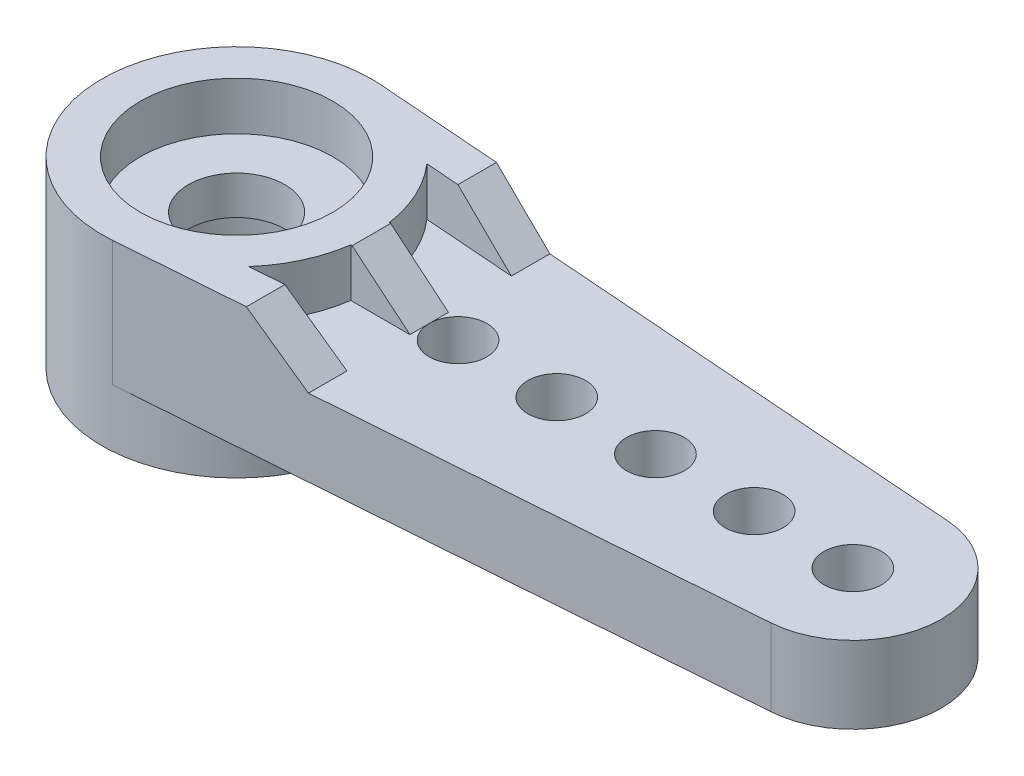
ISO-10303-21;
HEADER;
FILE_DESCRIPTION(('STEP AP214'),'2;1');
FILE_NAME('part.step','',(''),(''),'','','');
FILE_SCHEMA(('AUTOMOTIVE_DESIGN { 1 0 10303 214 1 1 1 1 }'));
ENDSEC;
DATA;
#1=APPLICATION_CONTEXT('core data for automotive mechanical design processes');
#2=APPLICATION_PROTOCOL_DEFINITION('international standard','automotive_design',2000,#1);
#3=PRODUCT_CONTEXT('',#1,'mechanical');
#4=PRODUCT('Part','Part','',(#3));
#5=PRODUCT_RELATED_PRODUCT_CATEGORY('part','',(#4));
#6=PRODUCT_DEFINITION_FORMATION('','',#4);
#7=PRODUCT_DEFINITION_CONTEXT('part definition',#1,'design');
#8=PRODUCT_DEFINITION('design','',#6,#7);
#9=PRODUCT_DEFINITION_SHAPE('','',#8);
#10=(LENGTH_UNIT() NAMED_UNIT(*) SI_UNIT(.MILLI.,.METRE.));
#11=(NAMED_UNIT(*) PLANE_ANGLE_UNIT() SI_UNIT($,.RADIAN.));
#12=(NAMED_UNIT(*) SI_UNIT($,.STERADIAN.) SOLID_ANGLE_UNIT());
#13=UNCERTAINTY_MEASURE_WITH_UNIT(LENGTH_MEASURE(1.E-05),#10,'distance_accuracy_value','');
#14=(GEOMETRIC_REPRESENTATION_CONTEXT(3) GLOBAL_UNCERTAINTY_ASSIGNED_CONTEXT((#13)) GLOBAL_UNIT_ASSIGNED_CONTEXT((#10,
#11,#12)) REPRESENTATION_CONTEXT('',''));
#15=CARTESIAN_POINT('',(0.,0.,0.));
#16=DIRECTION('',(0.,0.,1.));
#17=DIRECTION('',(1.,0.,0.));
#18=AXIS2_PLACEMENT_3D('',#15,#16,#17);
#19=CARTESIAN_POINT('',(0.,2.,0.));
#20=DIRECTION('',(0.,-1.,0.));
#21=DIRECTION('',(0.,0.,-1.));
#22=AXIS2_PLACEMENT_3D('',#19,#20,#21);
#23=CYLINDRICAL_SURFACE('',#22,3.5);
#24=DIRECTION('',(0.,-1.,0.));
#25=VECTOR('',#24,1.);
#26=CARTESIAN_POINT('',(2.62743232436456,8.17782908421862,-2.3122714764673));
#27=LINE('',#26,#25);
#28=CARTESIAN_POINT('',(2.62743232436456,3.25,-2.3122714764673));
#29=VERTEX_POINT('',#28);
#30=CARTESIAN_POINT('',(2.62743232436456,2.,-2.3122714764673));
#31=VERTEX_POINT('',#30);
#32=EDGE_CURVE('E166',#29,#31,#27,.T.);
#33=ORIENTED_EDGE('',*,*,#32,.F.);
#34=CARTESIAN_POINT('',(0.,3.25,0.));
#35=DIRECTION('',(0.,1.,0.));
#36=DIRECTION('',(0.,0.,1.));
#37=AXIS2_PLACEMENT_3D('',#34,#35,#36);
#38=CIRCLE('',#37,3.5);
#39=CARTESIAN_POINT('',(3.46410161513776,3.25,-0.5));
#40=VERTEX_POINT('',#39);
#41=EDGE_CURVE('E224',#40,#29,#38,.T.);
#42=ORIENTED_EDGE('',*,*,#41,.F.);
#43=DIRECTION('',(0.,-1.,0.));
#44=VECTOR('',#43,1.);
#45=CARTESIAN_POINT('',(3.46410161513776,2.,-0.5));
#46=LINE('',#45,#44);
#47=CARTESIAN_POINT('',(3.46410161513776,2.,-0.5));
#48=VERTEX_POINT('',#47);
#49=EDGE_CURVE('E246',#48,#40,#46,.F.);
#50=ORIENTED_EDGE('',*,*,#49,.F.);
#51=CARTESIAN_POINT('',(0.,2.,0.));
#52=DIRECTION('',(0.,1.,0.));
#53=DIRECTION('',(0.,0.,1.));
#54=AXIS2_PLACEMENT_3D('',#51,#52,#53);
#55=CIRCLE('',#54,3.5);
#56=EDGE_CURVE('E233',#48,#31,#55,.T.);
#57=ORIENTED_EDGE('',*,*,#56,.T.);
#58=EDGE_LOOP('',(#33,#42,#50,#57));
#59=FACE_BOUND('',#58,.T.);
#60=ADVANCED_FACE('F43',(#59),#23,.T.);
#61=CARTESIAN_POINT('',(0.,-1.5,0.));
#62=DIRECTION('',(0.,-1.,0.));
#63=DIRECTION('',(0.,0.,-1.));
#64=AXIS2_PLACEMENT_3D('',#61,#62,#63);
#65=CIRCLE('',#64,3.5);
#66=CARTESIAN_POINT('',(0.,-1.5,-3.5));
#67=VERTEX_POINT('',#66);
#68=EDGE_CURVE('E215',#67,#67,#65,.T.);
#69=ORIENTED_EDGE('',*,*,#68,.F.);
#70=EDGE_LOOP('',(#69));
#71=FACE_BOUND('',#70,.T.);
#72=CARTESIAN_POINT('',(0.2625,3.25,-3.49014236815635));
#73=VERTEX_POINT('',#72);
#74=CARTESIAN_POINT('',(0.2625,3.25,3.49014236815635));
#75=VERTEX_POINT('',#74);
#76=EDGE_CURVE('E234',#73,#75,#38,.T.);
#77=ORIENTED_EDGE('',*,*,#76,.F.);
#78=DIRECTION('',(0.,-1.,0.));
#79=VECTOR('',#78,1.);
#80=CARTESIAN_POINT('',(0.2625,2.,-3.49014236815635));
#81=LINE('',#80,#79);
#82=CARTESIAN_POINT('',(0.2625,0.,-3.49014236815635));
#83=VERTEX_POINT('',#82);
#84=EDGE_CURVE('E201',#73,#83,#81,.T.);
#85=ORIENTED_EDGE('',*,*,#84,.T.);
#86=CARTESIAN_POINT('',(0.,0.,0.));
#87=DIRECTION('',(0.,-1.,0.));
#88=DIRECTION('',(0.,0.,-1.));
#89=AXIS2_PLACEMENT_3D('',#86,#87,#88);
#90=CIRCLE('',#89,3.5);
#91=CARTESIAN_POINT('',(0.2625,0.,3.49014236815635));
#92=VERTEX_POINT('',#91);
#93=EDGE_CURVE('E220',#83,#92,#90,.T.);
#94=ORIENTED_EDGE('',*,*,#93,.T.);
#95=DIRECTION('',(0.,-1.,0.));
#96=VECTOR('',#95,1.);
#97=CARTESIAN_POINT('',(0.2625,2.,3.49014236815635));
#98=LINE('',#97,#96);
#99=EDGE_CURVE('E190',#75,#92,#98,.T.);
#100=ORIENTED_EDGE('',*,*,#99,.F.);
#101=EDGE_LOOP('',(#77,#85,#94,#100));
#102=FACE_BOUND('',#101,.T.);
#103=ADVANCED_FACE('F343',(#71,#102),#23,.T.);
#104=CARTESIAN_POINT('',(2.62743232436456,3.25,2.3122714764673));
#105=VERTEX_POINT('',#104);
#106=CARTESIAN_POINT('',(3.46410161513776,3.25,0.5));
#107=VERTEX_POINT('',#106);
#108=EDGE_CURVE('E229',#105,#107,#38,.T.);
#109=ORIENTED_EDGE('',*,*,#108,.F.);
#110=DIRECTION('',(0.,-1.,0.));
#111=VECTOR('',#110,1.);
#112=CARTESIAN_POINT('',(2.62743232436456,8.17782908421862,2.3122714764673));
#113=LINE('',#112,#111);
#114=CARTESIAN_POINT('',(2.62743232436456,2.,2.3122714764673));
#115=VERTEX_POINT('',#114);
#116=EDGE_CURVE('E268',#105,#115,#113,.T.);
#117=ORIENTED_EDGE('',*,*,#116,.T.);
#118=CARTESIAN_POINT('',(3.46410161513776,2.,0.5));
#119=VERTEX_POINT('',#118);
#120=EDGE_CURVE('E226',#115,#119,#55,.T.);
#121=ORIENTED_EDGE('',*,*,#120,.T.);
#122=DIRECTION('',(0.,-1.,0.));
#123=VECTOR('',#122,1.);
#124=CARTESIAN_POINT('',(3.46410161513776,2.,0.5));
#125=LINE('',#124,#123);
#126=EDGE_CURVE('E255',#107,#119,#125,.T.);
#127=ORIENTED_EDGE('',*,*,#126,.F.);
#128=EDGE_LOOP('',(#109,#117,#121,#127));
#129=FACE_BOUND('',#128,.T.);
#130=ADVANCED_FACE('F332',(#129),#23,.T.);
#131=CARTESIAN_POINT('',(0.,0.,0.));
#132=DIRECTION('',(0.,1.,0.));
#133=DIRECTION('',(0.,0.,1.));
#134=AXIS2_PLACEMENT_3D('',#131,#132,#133);
#135=PLANE('',#134);
#136=CARTESIAN_POINT('',(5.75,0.,0.));
#137=DIRECTION('',(0.,1.,0.));
#138=DIRECTION('',(0.,0.,1.));
#139=AXIS2_PLACEMENT_3D('',#136,#137,#138);
#140=CIRCLE('',#139,0.75);
#141=CARTESIAN_POINT('',(5.75,0.,0.75));
#142=VERTEX_POINT('',#141);
#143=EDGE_CURVE('E293',#142,#142,#140,.T.);
#144=ORIENTED_EDGE('',*,*,#143,.T.);
#145=EDGE_LOOP('',(#144));
#146=FACE_BOUND('',#145,.T.);
#147=CARTESIAN_POINT('',(8.3125,0.,0.));
#148=DIRECTION('',(0.,1.,0.));
#149=DIRECTION('',(0.,0.,1.));
#150=AXIS2_PLACEMENT_3D('',#147,#148,#149);
#151=CIRCLE('',#150,0.75);
#152=CARTESIAN_POINT('',(8.3125,0.,0.75));
#153=VERTEX_POINT('',#152);
#154=EDGE_CURVE('E271',#153,#153,#151,.T.);
#155=ORIENTED_EDGE('',*,*,#154,.T.);
#156=EDGE_LOOP('',(#155));
#157=FACE_BOUND('',#156,.T.);
#158=CARTESIAN_POINT('',(10.875,0.,0.));
#159=DIRECTION('',(0.,1.,0.));
#160=DIRECTION('',(0.,0.,1.));
#161=AXIS2_PLACEMENT_3D('',#158,#159,#160);
#162=CIRCLE('',#161,0.75);
#163=CARTESIAN_POINT('',(10.875,0.,0.75));
#164=VERTEX_POINT('',#163);
#165=EDGE_CURVE('E285',#164,#164,#162,.T.);
#166=ORIENTED_EDGE('',*,*,#165,.T.);
#167=EDGE_LOOP('',(#166));
#168=FACE_BOUND('',#167,.T.);
#169=CARTESIAN_POINT('',(13.4375,0.,0.));
#170=DIRECTION('',(0.,1.,0.));
#171=DIRECTION('',(0.,0.,1.));
#172=AXIS2_PLACEMENT_3D('',#169,#170,#171);
#173=CIRCLE('',#172,0.75);
#174=CARTESIAN_POINT('',(13.4375,0.,0.75));
#175=VERTEX_POINT('',#174);
#176=EDGE_CURVE('E284',#175,#175,#173,.T.);
#177=ORIENTED_EDGE('',*,*,#176,.T.);
#178=EDGE_LOOP('',(#177));
#179=FACE_BOUND('',#178,.T.);
#180=CARTESIAN_POINT('',(16.,0.,0.));
#181=DIRECTION('',(0.,1.,0.));
#182=DIRECTION('',(0.,0.,1.));
#183=AXIS2_PLACEMENT_3D('',#180,#181,#182);
#184=CIRCLE('',#183,0.750000000000002);
#185=CARTESIAN_POINT('',(16.,0.,0.750000000000002));
#186=VERTEX_POINT('',#185);
#187=EDGE_CURVE('E287',#186,#186,#184,.T.);
#188=ORIENTED_EDGE('',*,*,#187,.T.);
#189=EDGE_LOOP('',(#188));
#190=FACE_BOUND('',#189,.T.);
#191=ORIENTED_EDGE('',*,*,#93,.F.);
#192=DIRECTION('',(-0.997183533758957,0.,-0.075));
#193=VECTOR('',#192,1.);
#194=CARTESIAN_POINT('',(0.2625,0.,-3.49014236815635));
#195=LINE('',#194,#193);
#196=CARTESIAN_POINT('',(16.1725,0.,-2.2935221276456));
#197=VERTEX_POINT('',#196);
#198=EDGE_CURVE('E203',#197,#83,#195,.T.);
#199=ORIENTED_EDGE('',*,*,#198,.F.);
#200=CARTESIAN_POINT('',(16.,0.,0.));
#201=DIRECTION('',(0.,1.,0.));
#202=DIRECTION('',(0.,0.,1.));
#203=AXIS2_PLACEMENT_3D('',#200,#201,#202);
#204=CIRCLE('',#203,2.3);
#205=CARTESIAN_POINT('',(16.1725,0.,2.2935221276456));
#206=VERTEX_POINT('',#205);
#207=EDGE_CURVE('E206',#206,#197,#204,.T.);
#208=ORIENTED_EDGE('',*,*,#207,.F.);
#209=DIRECTION('',(0.997183533758957,0.,-0.075));
#210=VECTOR('',#209,1.);
#211=CARTESIAN_POINT('',(0.2625,0.,3.49014236815635));
#212=LINE('',#211,#210);
#213=EDGE_CURVE('E208',#92,#206,#212,.T.);
#214=ORIENTED_EDGE('',*,*,#213,.F.);
#215=EDGE_LOOP('',(#191,#199,#208,#214));
#216=FACE_BOUND('',#215,.T.);
#217=ADVANCED_FACE('F328',(#146,#157,#168,#179,#190,#216),#135,.F.);
#218=CARTESIAN_POINT('',(0.2625,2.,3.49014236815635));
#219=DIRECTION('',(-0.075,0.,-0.997183533758957));
#220=DIRECTION('',(-0.997183533758957,0.,0.075));
#221=AXIS2_PLACEMENT_3D('',#218,#219,#220);
#222=PLANE('',#221);
#223=DIRECTION('',(0.997183533758957,0.,-0.075));
#224=VECTOR('',#223,1.);
#225=CARTESIAN_POINT('',(0.2625,2.,3.49014236815635));
#226=LINE('',#225,#224);
#227=CARTESIAN_POINT('',(5.,2.,3.13382631602438));
#228=VERTEX_POINT('',#227);
#229=CARTESIAN_POINT('',(16.1725,2.,2.2935221276456));
#230=VERTEX_POINT('',#229);
#231=EDGE_CURVE('E210',#228,#230,#226,.T.);
#232=ORIENTED_EDGE('',*,*,#231,.F.);
#233=DIRECTION('',(-0.76694214693118,0.639118455775985,0.057683123590108));
#234=VECTOR('',#233,1.);
#235=CARTESIAN_POINT('',(3.64363029525031,3.1303080872914,3.23584136582444));
#236=LINE('',#235,#234);
#237=CARTESIAN_POINT('',(3.49999999999999,3.25,3.24664406340125));
#238=VERTEX_POINT('',#237);
#239=EDGE_CURVE('E176',#228,#238,#236,.T.);
#240=ORIENTED_EDGE('',*,*,#239,.T.);
#241=DIRECTION('',(0.997183533758957,0.,-0.0749999999999999));
#242=VECTOR('',#241,1.);
#243=CARTESIAN_POINT('',(0.2625,3.25,3.49014236815635));
#244=LINE('',#243,#242);
#245=EDGE_CURVE('E269',#75,#238,#244,.T.);
#246=ORIENTED_EDGE('',*,*,#245,.F.);
#247=ORIENTED_EDGE('',*,*,#99,.T.);
#248=ORIENTED_EDGE('',*,*,#213,.T.);
#249=DIRECTION('',(0.,-1.,0.));
#250=VECTOR('',#249,1.);
#251=CARTESIAN_POINT('',(16.1725,2.,2.2935221276456));
#252=LINE('',#251,#250);
#253=EDGE_CURVE('E193',#230,#206,#252,.T.);
#254=ORIENTED_EDGE('',*,*,#253,.F.);
#255=EDGE_LOOP('',(#232,#240,#246,#247,#248,#254));
#256=FACE_BOUND('',#255,.T.);
#257=ADVANCED_FACE('F335',(#256),#222,.F.);
#258=CARTESIAN_POINT('',(16.,2.,0.));
#259=DIRECTION('',(0.,-1.,0.));
#260=DIRECTION('',(0.,0.,-1.));
#261=AXIS2_PLACEMENT_3D('',#258,#259,#260);
#262=CYLINDRICAL_SURFACE('',#261,2.3);
#263=ORIENTED_EDGE('',*,*,#207,.T.);
#264=DIRECTION('',(0.,-1.,0.));
#265=VECTOR('',#264,1.);
#266=CARTESIAN_POINT('',(16.1725,2.,-2.2935221276456));
#267=LINE('',#266,#265);
#268=CARTESIAN_POINT('',(16.1725,2.,-2.2935221276456));
#269=VERTEX_POINT('',#268);
#270=EDGE_CURVE('E197',#269,#197,#267,.T.);
#271=ORIENTED_EDGE('',*,*,#270,.F.);
#272=CARTESIAN_POINT('',(16.,2.,0.));
#273=DIRECTION('',(0.,1.,0.));
#274=DIRECTION('',(0.,0.,1.));
#275=AXIS2_PLACEMENT_3D('',#272,#273,#274);
#276=CIRCLE('',#275,2.3);
#277=EDGE_CURVE('E211',#230,#269,#276,.T.);
#278=ORIENTED_EDGE('',*,*,#277,.F.);
#279=ORIENTED_EDGE('',*,*,#253,.T.);
#280=EDGE_LOOP('',(#263,#271,#278,#279));
#281=FACE_BOUND('',#280,.T.);
#282=ADVANCED_FACE('F389',(#281),#262,.T.);
#283=CARTESIAN_POINT('',(0.2625,2.,-3.49014236815635));
#284=DIRECTION('',(-0.075,0.,0.997183533758957));
#285=DIRECTION('',(0.997183533758957,0.,0.075));
#286=AXIS2_PLACEMENT_3D('',#283,#284,#285);
#287=PLANE('',#286);
#288=DIRECTION('',(-0.997183533758957,0.,-0.0749999999999999));
#289=VECTOR('',#288,1.);
#290=CARTESIAN_POINT('',(0.2625,3.25,-3.49014236815635));
#291=LINE('',#290,#289);
#292=CARTESIAN_POINT('',(3.49999999999999,3.25,-3.24664406340125));
#293=VERTEX_POINT('',#292);
#294=EDGE_CURVE('E159',#293,#73,#291,.T.);
#295=ORIENTED_EDGE('',*,*,#294,.F.);
#296=DIRECTION('',(0.76694214693118,-0.639118455775985,0.057683123590108));
#297=VECTOR('',#296,1.);
#298=CARTESIAN_POINT('',(3.64363029525031,3.1303080872914,-3.23584136582444));
#299=LINE('',#298,#297);
#300=CARTESIAN_POINT('',(5.,2.,-3.13382631602438));
#301=VERTEX_POINT('',#300);
#302=EDGE_CURVE('E172',#293,#301,#299,.T.);
#303=ORIENTED_EDGE('',*,*,#302,.T.);
#304=DIRECTION('',(-0.997183533758957,0.,-0.075));
#305=VECTOR('',#304,1.);
#306=CARTESIAN_POINT('',(0.2625,2.,-3.49014236815635));
#307=LINE('',#306,#305);
#308=EDGE_CURVE('E160',#269,#301,#307,.T.);
#309=ORIENTED_EDGE('',*,*,#308,.F.);
#310=ORIENTED_EDGE('',*,*,#270,.T.);
#311=ORIENTED_EDGE('',*,*,#198,.T.);
#312=ORIENTED_EDGE('',*,*,#84,.F.);
#313=EDGE_LOOP('',(#295,#303,#309,#310,#311,#312));
#314=FACE_BOUND('',#313,.T.);
#315=ADVANCED_FACE('F313',(#314),#287,.F.);
#316=CARTESIAN_POINT('',(0.,2.,0.));
#317=DIRECTION('',(0.,1.,0.));
#318=DIRECTION('',(0.,0.,1.));
#319=AXIS2_PLACEMENT_3D('',#316,#317,#318);
#320=PLANE('',#319);
#321=CARTESIAN_POINT('',(8.3125,2.,0.));
#322=DIRECTION('',(0.,1.,0.));
#323=DIRECTION('',(0.,0.,1.));
#324=AXIS2_PLACEMENT_3D('',#321,#322,#323);
#325=CIRCLE('',#324,0.75);
#326=CARTESIAN_POINT('',(8.3125,2.,0.75));
#327=VERTEX_POINT('',#326);
#328=EDGE_CURVE('E303',#327,#327,#325,.T.);
#329=ORIENTED_EDGE('',*,*,#328,.F.);
#330=EDGE_LOOP('',(#329));
#331=FACE_BOUND('',#330,.T.);
#332=CARTESIAN_POINT('',(10.875,2.,0.));
#333=DIRECTION('',(0.,1.,0.));
#334=DIRECTION('',(0.,0.,1.));
#335=AXIS2_PLACEMENT_3D('',#332,#333,#334);
#336=CIRCLE('',#335,0.75);
#337=CARTESIAN_POINT('',(10.875,2.,0.75));
#338=VERTEX_POINT('',#337);
#339=EDGE_CURVE('E297',#338,#338,#336,.T.);
#340=ORIENTED_EDGE('',*,*,#339,.F.);
#341=EDGE_LOOP('',(#340));
#342=FACE_BOUND('',#341,.T.);
#343=CARTESIAN_POINT('',(13.4375,2.,0.));
#344=DIRECTION('',(0.,1.,0.));
#345=DIRECTION('',(0.,0.,1.));
#346=AXIS2_PLACEMENT_3D('',#343,#344,#345);
#347=CIRCLE('',#346,0.75);
#348=CARTESIAN_POINT('',(13.4375,2.,0.75));
#349=VERTEX_POINT('',#348);
#350=EDGE_CURVE('E300',#349,#349,#347,.T.);
#351=ORIENTED_EDGE('',*,*,#350,.F.);
#352=EDGE_LOOP('',(#351));
#353=FACE_BOUND('',#352,.T.);
#354=CARTESIAN_POINT('',(16.,2.,0.));
#355=DIRECTION('',(0.,1.,0.));
#356=DIRECTION('',(0.,0.,1.));
#357=AXIS2_PLACEMENT_3D('',#354,#355,#356);
#358=CIRCLE('',#357,0.750000000000002);
#359=CARTESIAN_POINT('',(16.,2.,0.750000000000002));
#360=VERTEX_POINT('',#359);
#361=EDGE_CURVE('E295',#360,#360,#358,.T.);
#362=ORIENTED_EDGE('',*,*,#361,.F.);
#363=EDGE_LOOP('',(#362));
#364=FACE_BOUND('',#363,.T.);
#365=DIRECTION('',(0.,0.,-1.));
#366=VECTOR('',#365,1.);
#367=CARTESIAN_POINT('',(5.,2.,0.5));
#368=LINE('',#367,#366);
#369=CARTESIAN_POINT('',(5.,1.99999999999999,0.));
#370=VERTEX_POINT('',#369);
#371=CARTESIAN_POINT('',(5.,2.,-0.5));
#372=VERTEX_POINT('',#371);
#373=EDGE_CURVE('E261',#370,#372,#368,.T.);
#374=ORIENTED_EDGE('',*,*,#373,.F.);
#375=CARTESIAN_POINT('',(5.75,2.,0.));
#376=DIRECTION('',(0.,1.,0.));
#377=DIRECTION('',(0.,0.,1.));
#378=AXIS2_PLACEMENT_3D('',#375,#376,#377);
#379=CIRCLE('',#378,0.75);
#380=EDGE_CURVE('E60',#370,#370,#379,.T.);
#381=ORIENTED_EDGE('',*,*,#380,.F.);
#382=CARTESIAN_POINT('',(5.,2.,0.5));
#383=VERTEX_POINT('',#382);
#384=EDGE_CURVE('E250',#383,#370,#368,.T.);
#385=ORIENTED_EDGE('',*,*,#384,.F.);
#386=DIRECTION('',(1.,0.,0.));
#387=VECTOR('',#386,1.);
#388=CARTESIAN_POINT('',(-3.501,2.,0.5));
#389=LINE('',#388,#387);
#390=EDGE_CURVE('E245',#119,#383,#389,.T.);
#391=ORIENTED_EDGE('',*,*,#390,.F.);
#392=ORIENTED_EDGE('',*,*,#120,.F.);
#393=DIRECTION('',(-0.997183533758956,0.,0.0750000000000002));
#394=VECTOR('',#393,1.);
#395=CARTESIAN_POINT('',(2.62743232436456,2.,2.3122714764673));
#396=LINE('',#395,#394);
#397=CARTESIAN_POINT('',(5.,2.,2.13382631602438));
#398=VERTEX_POINT('',#397);
#399=EDGE_CURVE('E265',#398,#115,#396,.T.);
#400=ORIENTED_EDGE('',*,*,#399,.F.);
#401=DIRECTION('',(0.,0.,-1.));
#402=VECTOR('',#401,1.);
#403=CARTESIAN_POINT('',(5.,2.,3.13382631602438));
#404=LINE('',#403,#402);
#405=EDGE_CURVE('E264',#228,#398,#404,.T.);
#406=ORIENTED_EDGE('',*,*,#405,.F.);
#407=ORIENTED_EDGE('',*,*,#231,.T.);
#408=ORIENTED_EDGE('',*,*,#277,.T.);
#409=ORIENTED_EDGE('',*,*,#308,.T.);
#410=DIRECTION('',(0.,0.,-1.));
#411=VECTOR('',#410,1.);
#412=CARTESIAN_POINT('',(5.,2.,-3.13382631602438));
#413=LINE('',#412,#411);
#414=CARTESIAN_POINT('',(5.,2.,-2.13382631602438));
#415=VERTEX_POINT('',#414);
#416=EDGE_CURVE('E146',#415,#301,#413,.T.);
#417=ORIENTED_EDGE('',*,*,#416,.F.);
#418=DIRECTION('',(0.997183533758956,0.,0.0750000000000002));
#419=VECTOR('',#418,1.);
#420=CARTESIAN_POINT('',(2.62743232436456,2.,-2.3122714764673));
#421=LINE('',#420,#419);
#422=EDGE_CURVE('E153',#31,#415,#421,.T.);
#423=ORIENTED_EDGE('',*,*,#422,.F.);
#424=ORIENTED_EDGE('',*,*,#56,.F.);
#425=DIRECTION('',(1.,0.,0.));
#426=VECTOR('',#425,1.);
#427=CARTESIAN_POINT('',(-3.501,2.,-0.5));
#428=LINE('',#427,#426);
#429=EDGE_CURVE('E243',#48,#372,#428,.T.);
#430=ORIENTED_EDGE('',*,*,#429,.T.);
#431=EDGE_LOOP('',(#374,#381,#385,#391,#392,#400,#406,#407,#408,#409,#417,#423,#424,#430));
#432=FACE_BOUND('',#431,.T.);
#433=ADVANCED_FACE('F155',(#331,#342,#353,#364,#432),#320,.T.);
#434=CARTESIAN_POINT('',(0.,-1.5,0.));
#435=DIRECTION('',(0.,-1.,0.));
#436=DIRECTION('',(0.,0.,-1.));
#437=AXIS2_PLACEMENT_3D('',#434,#435,#436);
#438=PLANE('',#437);
#439=CARTESIAN_POINT('',(0.,-1.5,0.));
#440=DIRECTION('',(0.,-1.,0.));
#441=DIRECTION('',(0.,0.,-1.));
#442=AXIS2_PLACEMENT_3D('',#439,#440,#441);
#443=CIRCLE('',#442,2.6);
#444=CARTESIAN_POINT('',(0.,-1.5,-2.6));
#445=VERTEX_POINT('',#444);
#446=EDGE_CURVE('E225',#445,#445,#443,.T.);
#447=ORIENTED_EDGE('',*,*,#446,.F.);
#448=EDGE_LOOP('',(#447));
#449=FACE_BOUND('',#448,.T.);
#450=ORIENTED_EDGE('',*,*,#68,.T.);
#451=EDGE_LOOP('',(#450));
#452=FACE_BOUND('',#451,.T.);
#453=ADVANCED_FACE('F312',(#449,#452),#438,.T.);
#454=CARTESIAN_POINT('',(0.,1.,0.));
#455=DIRECTION('',(0.,-1.,0.));
#456=DIRECTION('',(0.,0.,-1.));
#457=AXIS2_PLACEMENT_3D('',#454,#455,#456);
#458=CYLINDRICAL_SURFACE('',#457,2.6);
#459=CARTESIAN_POINT('',(0.,1.,0.));
#460=DIRECTION('',(0.,-1.,0.));
#461=DIRECTION('',(0.,0.,-1.));
#462=AXIS2_PLACEMENT_3D('',#459,#460,#461);
#463=CIRCLE('',#462,2.6);
#464=CARTESIAN_POINT('',(0.,1.,-2.6));
#465=VERTEX_POINT('',#464);
#466=EDGE_CURVE('E218',#465,#465,#463,.T.);
#467=ORIENTED_EDGE('',*,*,#466,.F.);
#468=EDGE_LOOP('',(#467));
#469=FACE_BOUND('',#468,.T.);
#470=ORIENTED_EDGE('',*,*,#446,.T.);
#471=EDGE_LOOP('',(#470));
#472=FACE_BOUND('',#471,.T.);
#473=ADVANCED_FACE('F552',(#469,#472),#458,.F.);
#474=CARTESIAN_POINT('',(0.,1.,0.));
#475=DIRECTION('',(0.,-1.,0.));
#476=DIRECTION('',(0.,0.,-1.));
#477=AXIS2_PLACEMENT_3D('',#474,#475,#476);
#478=PLANE('',#477);
#479=CARTESIAN_POINT('',(0.,1.,0.));
#480=DIRECTION('',(0.,-1.,0.));
#481=DIRECTION('',(0.,0.,-1.));
#482=AXIS2_PLACEMENT_3D('',#479,#480,#481);
#483=CIRCLE('',#482,1.25);
#484=CARTESIAN_POINT('',(0.,1.,-1.25));
#485=VERTEX_POINT('',#484);
#486=EDGE_CURVE('E189',#485,#485,#483,.T.);
#487=ORIENTED_EDGE('',*,*,#486,.F.);
#488=EDGE_LOOP('',(#487));
#489=FACE_BOUND('',#488,.T.);
#490=ORIENTED_EDGE('',*,*,#466,.T.);
#491=EDGE_LOOP('',(#490));
#492=FACE_BOUND('',#491,.T.);
#493=ADVANCED_FACE('F407',(#489,#492),#478,.T.);
#494=CARTESIAN_POINT('',(0.,3.25,0.));
#495=DIRECTION('',(0.,1.,0.));
#496=DIRECTION('',(0.,0.,1.));
#497=AXIS2_PLACEMENT_3D('',#494,#495,#496);
#498=PLANE('',#497);
#499=CARTESIAN_POINT('',(0.,3.25,0.));
#500=DIRECTION('',(0.,1.,0.));
#501=DIRECTION('',(0.,0.,1.));
#502=AXIS2_PLACEMENT_3D('',#499,#500,#501);
#503=CIRCLE('',#502,2.5);
#504=CARTESIAN_POINT('',(0.,3.25,2.5));
#505=VERTEX_POINT('',#504);
#506=EDGE_CURVE('E192',#505,#505,#503,.T.);
#507=ORIENTED_EDGE('',*,*,#506,.F.);
#508=EDGE_LOOP('',(#507));
#509=FACE_BOUND('',#508,.T.);
#510=ORIENTED_EDGE('',*,*,#245,.T.);
#511=DIRECTION('',(0.,0.,-1.));
#512=VECTOR('',#511,1.);
#513=CARTESIAN_POINT('',(3.49999999999999,3.25,2.13382631602438));
#514=LINE('',#513,#512);
#515=CARTESIAN_POINT('',(3.49999999999999,3.25,2.24664406340126));
#516=VERTEX_POINT('',#515);
#517=EDGE_CURVE('E185',#238,#516,#514,.T.);
#518=ORIENTED_EDGE('',*,*,#517,.T.);
#519=DIRECTION('',(-0.997183533758957,0.,0.0750000000000002));
#520=VECTOR('',#519,1.);
#521=CARTESIAN_POINT('',(2.62743232436456,3.25,2.3122714764673));
#522=LINE('',#521,#520);
#523=EDGE_CURVE('E266',#516,#105,#522,.T.);
#524=ORIENTED_EDGE('',*,*,#523,.T.);
#525=ORIENTED_EDGE('',*,*,#108,.T.);
#526=DIRECTION('',(1.,0.,0.));
#527=VECTOR('',#526,1.);
#528=CARTESIAN_POINT('',(-3.501,3.25,0.5));
#529=LINE('',#528,#527);
#530=CARTESIAN_POINT('',(3.49999999999999,3.25,0.5));
#531=VERTEX_POINT('',#530);
#532=EDGE_CURVE('E249',#107,#531,#529,.T.);
#533=ORIENTED_EDGE('',*,*,#532,.T.);
#534=DIRECTION('',(0.,0.,-1.));
#535=VECTOR('',#534,1.);
#536=CARTESIAN_POINT('',(3.49999999999999,3.25,0.));
#537=LINE('',#536,#535);
#538=CARTESIAN_POINT('',(3.49999999999999,3.25,-0.5));
#539=VERTEX_POINT('',#538);
#540=EDGE_CURVE('E61',#531,#539,#537,.T.);
#541=ORIENTED_EDGE('',*,*,#540,.T.);
#542=DIRECTION('',(1.,0.,0.));
#543=VECTOR('',#542,1.);
#544=CARTESIAN_POINT('',(-3.501,3.25,-0.5));
#545=LINE('',#544,#543);
#546=EDGE_CURVE('E247',#40,#539,#545,.T.);
#547=ORIENTED_EDGE('',*,*,#546,.F.);
#548=ORIENTED_EDGE('',*,*,#41,.T.);
#549=DIRECTION('',(0.997183533758957,0.,0.0750000000000002));
#550=VECTOR('',#549,1.);
#551=CARTESIAN_POINT('',(2.62743232436456,3.25,-2.3122714764673));
#552=LINE('',#551,#550);
#553=CARTESIAN_POINT('',(3.49999999999999,3.25,-2.24664406340126));
#554=VERTEX_POINT('',#553);
#555=EDGE_CURVE('E279',#29,#554,#552,.T.);
#556=ORIENTED_EDGE('',*,*,#555,.T.);
#557=DIRECTION('',(0.,0.,-1.));
#558=VECTOR('',#557,1.);
#559=CARTESIAN_POINT('',(3.49999999999999,3.25,-3.13382631602438));
#560=LINE('',#559,#558);
#561=EDGE_CURVE('E173',#554,#293,#560,.T.);
#562=ORIENTED_EDGE('',*,*,#561,.T.);
#563=ORIENTED_EDGE('',*,*,#294,.T.);
#564=ORIENTED_EDGE('',*,*,#76,.T.);
#565=EDGE_LOOP('',(#510,#518,#524,#525,#533,#541,#547,#548,#556,#562,#563,#564));
#566=FACE_BOUND('',#565,.T.);
#567=ADVANCED_FACE('F349',(#509,#566),#498,.T.);
#568=CARTESIAN_POINT('',(0.,2.,0.));
#569=DIRECTION('',(0.,1.,0.));
#570=DIRECTION('',(0.,0.,1.));
#571=AXIS2_PLACEMENT_3D('',#568,#569,#570);
#572=CYLINDRICAL_SURFACE('',#571,2.5);
#573=CARTESIAN_POINT('',(0.,2.,0.));
#574=DIRECTION('',(0.,1.,0.));
#575=DIRECTION('',(0.,0.,1.));
#576=AXIS2_PLACEMENT_3D('',#573,#574,#575);
#577=CIRCLE('',#576,2.5);
#578=CARTESIAN_POINT('',(0.,2.,2.5));
#579=VERTEX_POINT('',#578);
#580=EDGE_CURVE('E240',#579,#579,#577,.T.);
#581=ORIENTED_EDGE('',*,*,#580,.F.);
#582=EDGE_LOOP('',(#581));
#583=FACE_BOUND('',#582,.T.);
#584=ORIENTED_EDGE('',*,*,#506,.T.);
#585=EDGE_LOOP('',(#584));
#586=FACE_BOUND('',#585,.T.);
#587=ADVANCED_FACE('F403',(#583,#586),#572,.F.);
#588=CARTESIAN_POINT('',(0.,2.,0.));
#589=DIRECTION('',(0.,1.,0.));
#590=DIRECTION('',(0.,0.,1.));
#591=AXIS2_PLACEMENT_3D('',#588,#589,#590);
#592=PLANE('',#591);
#593=CARTESIAN_POINT('',(0.,2.,0.));
#594=DIRECTION('',(0.,1.,0.));
#595=DIRECTION('',(0.,0.,1.));
#596=AXIS2_PLACEMENT_3D('',#593,#594,#595);
#597=CIRCLE('',#596,1.25);
#598=CARTESIAN_POINT('',(0.,2.,1.25));
#599=VERTEX_POINT('',#598);
#600=EDGE_CURVE('E195',#599,#599,#597,.T.);
#601=ORIENTED_EDGE('',*,*,#600,.F.);
#602=EDGE_LOOP('',(#601));
#603=FACE_BOUND('',#602,.T.);
#604=ORIENTED_EDGE('',*,*,#580,.T.);
#605=EDGE_LOOP('',(#604));
#606=FACE_BOUND('',#605,.T.);
#607=ADVANCED_FACE('F545',(#603,#606),#592,.T.);
#608=CARTESIAN_POINT('',(0.,-1.5,0.));
#609=DIRECTION('',(0.,1.,0.));
#610=DIRECTION('',(0.,0.,1.));
#611=AXIS2_PLACEMENT_3D('',#608,#609,#610);
#612=CYLINDRICAL_SURFACE('',#611,1.25);
#613=ORIENTED_EDGE('',*,*,#486,.T.);
#614=EDGE_LOOP('',(#613));
#615=FACE_BOUND('',#614,.T.);
#616=ORIENTED_EDGE('',*,*,#600,.T.);
#617=EDGE_LOOP('',(#616));
#618=FACE_BOUND('',#617,.T.);
#619=ADVANCED_FACE('F414',(#615,#618),#612,.F.);
#620=CARTESIAN_POINT('',(-3.501,3.25,-0.5));
#621=DIRECTION('',(0.,0.,-1.));
#622=DIRECTION('',(0.,1.,0.));
#623=AXIS2_PLACEMENT_3D('',#620,#621,#622);
#624=PLANE('',#623);
#625=ORIENTED_EDGE('',*,*,#546,.T.);
#626=DIRECTION('',(-0.768221279597376,0.64018439966448,0.));
#627=VECTOR('',#626,1.);
#628=CARTESIAN_POINT('',(-0.631737704918039,6.69311475409836,-0.5));
#629=LINE('',#628,#627);
#630=EDGE_CURVE('E11',#539,#372,#629,.F.);
#631=ORIENTED_EDGE('',*,*,#630,.T.);
#632=ORIENTED_EDGE('',*,*,#429,.F.);
#633=ORIENTED_EDGE('',*,*,#49,.T.);
#634=EDGE_LOOP('',(#625,#631,#632,#633));
#635=FACE_BOUND('',#634,.T.);
#636=ADVANCED_FACE('F364',(#635),#624,.T.);
#637=CARTESIAN_POINT('',(-3.501,3.25,0.5));
#638=DIRECTION('',(0.,0.,1.));
#639=DIRECTION('',(0.,-1.,0.));
#640=AXIS2_PLACEMENT_3D('',#637,#638,#639);
#641=PLANE('',#640);
#642=ORIENTED_EDGE('',*,*,#390,.T.);
#643=DIRECTION('',(0.768221279597376,-0.64018439966448,0.));
#644=VECTOR('',#643,1.);
#645=CARTESIAN_POINT('',(-0.631737704918039,6.69311475409836,0.5));
#646=LINE('',#645,#644);
#647=EDGE_CURVE('E55',#383,#531,#646,.F.);
#648=ORIENTED_EDGE('',*,*,#647,.T.);
#649=ORIENTED_EDGE('',*,*,#532,.F.);
#650=ORIENTED_EDGE('',*,*,#126,.T.);
#651=EDGE_LOOP('',(#642,#648,#649,#650));
#652=FACE_BOUND('',#651,.T.);
#653=ADVANCED_FACE('F356',(#652),#641,.T.);
#654=CARTESIAN_POINT('',(2.62743232436456,8.17782908421862,2.3122714764673));
#655=DIRECTION('',(0.0750000000000002,0.,0.997183533758956));
#656=DIRECTION('',(0.997183533758957,0.,-0.0750000000000002));
#657=AXIS2_PLACEMENT_3D('',#654,#655,#656);
#658=PLANE('',#657);
#659=ORIENTED_EDGE('',*,*,#523,.F.);
#660=DIRECTION('',(0.766942146931181,-0.639118455775985,-0.0576831235901082));
#661=VECTOR('',#660,1.);
#662=CARTESIAN_POINT('',(3.59939067660242,3.16717443616464,2.23916870857156));
#663=LINE('',#662,#661);
#664=EDGE_CURVE('E179',#516,#398,#663,.T.);
#665=ORIENTED_EDGE('',*,*,#664,.T.);
#666=ORIENTED_EDGE('',*,*,#399,.T.);
#667=ORIENTED_EDGE('',*,*,#116,.F.);
#668=EDGE_LOOP('',(#659,#665,#666,#667));
#669=FACE_BOUND('',#668,.T.);
#670=ADVANCED_FACE('F421',(#669),#658,.F.);
#671=CARTESIAN_POINT('',(2.62743232436456,8.17782908421862,-2.3122714764673));
#672=DIRECTION('',(0.0750000000000002,0.,-0.997183533758956));
#673=DIRECTION('',(-0.997183533758957,0.,-0.0750000000000002));
#674=AXIS2_PLACEMENT_3D('',#671,#672,#673);
#675=PLANE('',#674);
#676=ORIENTED_EDGE('',*,*,#422,.T.);
#677=DIRECTION('',(-0.766942146931181,0.639118455775985,-0.0576831235901082));
#678=VECTOR('',#677,1.);
#679=CARTESIAN_POINT('',(3.59939067660242,3.16717443616464,-2.23916870857156));
#680=LINE('',#679,#678);
#681=EDGE_CURVE('E168',#415,#554,#680,.T.);
#682=ORIENTED_EDGE('',*,*,#681,.T.);
#683=ORIENTED_EDGE('',*,*,#555,.F.);
#684=ORIENTED_EDGE('',*,*,#32,.T.);
#685=EDGE_LOOP('',(#676,#682,#683,#684));
#686=FACE_BOUND('',#685,.T.);
#687=ADVANCED_FACE('F165',(#686),#675,.F.);
#688=CARTESIAN_POINT('',(3.49999999999999,3.25,0.));
#689=DIRECTION('',(0.640184399664481,0.768221279597375,0.));
#690=DIRECTION('',(0.,0.,1.));
#691=AXIS2_PLACEMENT_3D('',#688,#689,#690);
#692=PLANE('',#691);
#693=ORIENTED_EDGE('',*,*,#239,.F.);
#694=ORIENTED_EDGE('',*,*,#405,.T.);
#695=ORIENTED_EDGE('',*,*,#664,.F.);
#696=ORIENTED_EDGE('',*,*,#517,.F.);
#697=EDGE_LOOP('',(#693,#694,#695,#696));
#698=FACE_BOUND('',#697,.T.);
#699=ADVANCED_FACE('F437',(#698),#692,.T.);
#700=CARTESIAN_POINT('',(3.49999999999999,3.25,0.));
#701=DIRECTION('',(0.640184399664481,0.768221279597375,0.));
#702=DIRECTION('',(0.,0.,1.));
#703=AXIS2_PLACEMENT_3D('',#700,#701,#702);
#704=PLANE('',#703);
#705=ORIENTED_EDGE('',*,*,#681,.F.);
#706=ORIENTED_EDGE('',*,*,#416,.T.);
#707=ORIENTED_EDGE('',*,*,#302,.F.);
#708=ORIENTED_EDGE('',*,*,#561,.F.);
#709=EDGE_LOOP('',(#705,#706,#707,#708));
#710=FACE_BOUND('',#709,.T.);
#711=ADVANCED_FACE('F171',(#710),#704,.T.);
#712=CARTESIAN_POINT('',(5.,1.99999999999999,0.));
#713=DIRECTION('',(-0.64018439966448,-0.768221279597376,0.));
#714=DIRECTION('',(0.,0.,1.));
#715=AXIS2_PLACEMENT_3D('',#712,#713,#714);
#716=PLANE('',#715);
#717=ORIENTED_EDGE('',*,*,#630,.F.);
#718=ORIENTED_EDGE('',*,*,#540,.F.);
#719=ORIENTED_EDGE('',*,*,#647,.F.);
#720=ORIENTED_EDGE('',*,*,#384,.T.);
#721=ORIENTED_EDGE('',*,*,#373,.T.);
#722=EDGE_LOOP('',(#717,#718,#719,#720,#721));
#723=FACE_BOUND('',#722,.T.);
#724=ADVANCED_FACE('F46',(#723),#716,.F.);
#725=CARTESIAN_POINT('',(16.,-1.5,0.));
#726=DIRECTION('',(0.,1.,0.));
#727=DIRECTION('',(0.,0.,1.));
#728=AXIS2_PLACEMENT_3D('',#725,#726,#727);
#729=CYLINDRICAL_SURFACE('',#728,0.750000000000002);
#730=ORIENTED_EDGE('',*,*,#361,.T.);
#731=EDGE_LOOP('',(#730));
#732=FACE_BOUND('',#731,.T.);
#733=ORIENTED_EDGE('',*,*,#187,.F.);
#734=EDGE_LOOP('',(#733));
#735=FACE_BOUND('',#734,.T.);
#736=ADVANCED_FACE('F325',(#732,#735),#729,.F.);
#737=CARTESIAN_POINT('',(13.4375,-1.5,0.));
#738=DIRECTION('',(0.,1.,0.));
#739=DIRECTION('',(0.,0.,1.));
#740=AXIS2_PLACEMENT_3D('',#737,#738,#739);
#741=CYLINDRICAL_SURFACE('',#740,0.75);
#742=ORIENTED_EDGE('',*,*,#350,.T.);
#743=EDGE_LOOP('',(#742));
#744=FACE_BOUND('',#743,.T.);
#745=ORIENTED_EDGE('',*,*,#176,.F.);
#746=EDGE_LOOP('',(#745));
#747=FACE_BOUND('',#746,.T.);
#748=ADVANCED_FACE('F323',(#744,#747),#741,.F.);
#749=CARTESIAN_POINT('',(10.875,-1.5,0.));
#750=DIRECTION('',(0.,1.,0.));
#751=DIRECTION('',(0.,0.,1.));
#752=AXIS2_PLACEMENT_3D('',#749,#750,#751);
#753=CYLINDRICAL_SURFACE('',#752,0.75);
#754=ORIENTED_EDGE('',*,*,#339,.T.);
#755=EDGE_LOOP('',(#754));
#756=FACE_BOUND('',#755,.T.);
#757=ORIENTED_EDGE('',*,*,#165,.F.);
#758=EDGE_LOOP('',(#757));
#759=FACE_BOUND('',#758,.T.);
#760=ADVANCED_FACE('F481',(#756,#759),#753,.F.);
#761=CARTESIAN_POINT('',(8.3125,-1.5,0.));
#762=DIRECTION('',(0.,1.,0.));
#763=DIRECTION('',(0.,0.,1.));
#764=AXIS2_PLACEMENT_3D('',#761,#762,#763);
#765=CYLINDRICAL_SURFACE('',#764,0.75);
#766=ORIENTED_EDGE('',*,*,#328,.T.);
#767=EDGE_LOOP('',(#766));
#768=FACE_BOUND('',#767,.T.);
#769=ORIENTED_EDGE('',*,*,#154,.F.);
#770=EDGE_LOOP('',(#769));
#771=FACE_BOUND('',#770,.T.);
#772=ADVANCED_FACE('F308',(#768,#771),#765,.F.);
#773=CARTESIAN_POINT('',(5.75,-1.5,0.));
#774=DIRECTION('',(0.,1.,0.));
#775=DIRECTION('',(0.,0.,1.));
#776=AXIS2_PLACEMENT_3D('',#773,#774,#775);
#777=CYLINDRICAL_SURFACE('',#776,0.75);
#778=ORIENTED_EDGE('',*,*,#380,.T.);
#779=EDGE_LOOP('',(#778));
#780=FACE_BOUND('',#779,.T.);
#781=ORIENTED_EDGE('',*,*,#143,.F.);
#782=EDGE_LOOP('',(#781));
#783=FACE_BOUND('',#782,.T.);
#784=ADVANCED_FACE('F498',(#780,#783),#777,.F.);
#785=CLOSED_SHELL('',(#60,#103,#130,#217,#257,#282,#315,#433,#453,#473,#493,#567,#587,#607,#619,
#636,#653,#670,#687,#699,#711,#724,#736,#748,#760,#772,#784));
#786=MANIFOLD_SOLID_BREP('B2',#785);
#787=ADVANCED_BREP_SHAPE_REPRESENTATION('',(#18,#786),#14);
#788=SHAPE_DEFINITION_REPRESENTATION(#9,#787);
ENDSEC;
END-ISO-10303-21;
